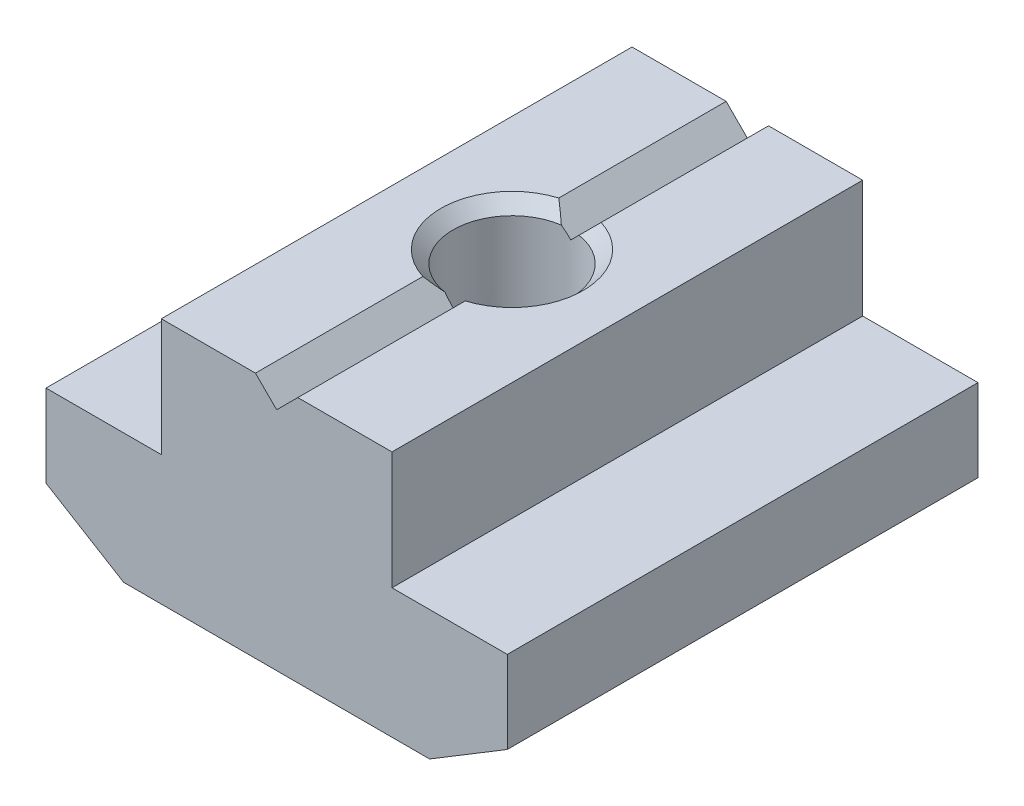
ISO-10303-21;
HEADER;
FILE_DESCRIPTION(('STEP AP214'),'2;1');
FILE_NAME('part.step','',(''),(''),'','','');
FILE_SCHEMA(('AUTOMOTIVE_DESIGN { 1 0 10303 214 1 1 1 1 }'));
ENDSEC;
DATA;
#1=APPLICATION_CONTEXT('core data for automotive mechanical design processes');
#2=APPLICATION_PROTOCOL_DEFINITION('international standard','automotive_design',2000,#1);
#3=PRODUCT_CONTEXT('',#1,'mechanical');
#4=PRODUCT('Part','Part','',(#3));
#5=PRODUCT_RELATED_PRODUCT_CATEGORY('part','',(#4));
#6=PRODUCT_DEFINITION_FORMATION('','',#4);
#7=PRODUCT_DEFINITION_CONTEXT('part definition',#1,'design');
#8=PRODUCT_DEFINITION('design','',#6,#7);
#9=PRODUCT_DEFINITION_SHAPE('','',#8);
#10=(LENGTH_UNIT() NAMED_UNIT(*) SI_UNIT(.MILLI.,.METRE.));
#11=(NAMED_UNIT(*) PLANE_ANGLE_UNIT() SI_UNIT($,.RADIAN.));
#12=(NAMED_UNIT(*) SI_UNIT($,.STERADIAN.) SOLID_ANGLE_UNIT());
#13=UNCERTAINTY_MEASURE_WITH_UNIT(LENGTH_MEASURE(1.E-05),#10,'distance_accuracy_value','');
#14=(GEOMETRIC_REPRESENTATION_CONTEXT(3) GLOBAL_UNCERTAINTY_ASSIGNED_CONTEXT((#13)) GLOBAL_UNIT_ASSIGNED_CONTEXT((#10,
#11,#12)) REPRESENTATION_CONTEXT('',''));
#15=CARTESIAN_POINT('',(0.,0.,0.));
#16=DIRECTION('',(0.,0.,1.));
#17=DIRECTION('',(1.,0.,0.));
#18=AXIS2_PLACEMENT_3D('',#15,#16,#17);
#19=CARTESIAN_POINT('',(-0.9,10.5,-45.));
#20=DIRECTION('',(-0.707106781186547,-0.707106781186548,0.));
#21=DIRECTION('',(0.707106781186548,-0.707106781186547,0.));
#22=AXIS2_PLACEMENT_3D('',#19,#20,#21);
#23=PLANE('',#22);
#24=DIRECTION('',(0.,0.,1.));
#25=VECTOR('',#24,1.);
#26=CARTESIAN_POINT('',(0.,9.6,-45.));
#27=LINE('',#26,#25);
#28=CARTESIAN_POINT('',(0.,9.6,-7.50000000000002));
#29=VERTEX_POINT('',#28);
#30=CARTESIAN_POINT('',(0.,9.6,0.));
#31=VERTEX_POINT('',#30);
#32=EDGE_CURVE('E300',#29,#31,#27,.T.);
#33=ORIENTED_EDGE('',*,*,#32,.F.);
#34=CARTESIAN_POINT('',(0.,9.6,-10.));
#35=DIRECTION('',(-0.707106781186547,-0.707106781186548,0.));
#36=DIRECTION('',(-0.707106781186548,0.707106781186547,0.));
#37=AXIS2_PLACEMENT_3D('',#34,#35,#36);
#38=ELLIPSE('',#37,3.53553390593273,2.5);
#39=CARTESIAN_POINT('',(-0.374999999999994,9.975,-7.52828500833935));
#40=VERTEX_POINT('',#39);
#41=EDGE_CURVE('E11',#29,#40,#38,.T.);
#42=ORIENTED_EDGE('',*,*,#41,.T.);
#43=CARTESIAN_POINT('',(-0.374799999999994,9.97479999999999,-7.5284569597112));
#44=CARTESIAN_POINT('',(-0.417708570571395,10.0177085705714,-7.49156815284837));
#45=CARTESIAN_POINT('',(-0.460872832569081,10.0608728325691,-7.45527855689437));
#46=CARTESIAN_POINT('',(-0.547646636628367,10.1476466366284,-7.38381885597797));
#47=CARTESIAN_POINT('',(-0.591256053100125,10.1912560531001,-7.34864844619643));
#48=CARTESIAN_POINT('',(-0.67887487539868,10.2788748753987,-7.27933024964659));
#49=CARTESIAN_POINT('',(-0.722884255260862,10.3228842552609,-7.2451823971059));
#50=CARTESIAN_POINT('',(-0.81127588042446,10.4112758804245,-7.17782368323249));
#51=CARTESIAN_POINT('',(-0.855658224805188,10.4556582248052,-7.14461308179715));
#52=CARTESIAN_POINT('',(-0.9002,10.5002,-7.1118388202872));
#53=B_SPLINE_CURVE_WITH_KNOTS('',3,(#43,#44,#45,#46,#47,#48,#49,#50,#51,#52),.UNSPECIFIED.,.F.,
.F.,(4,2,2,2,4),(0.,0.213037107931229,0.426015688104344,0.638980539625976,0.852003876790891),.UNSPECIFIED.);
#54=CARTESIAN_POINT('',(-0.899999999999998,10.5,-7.11198597648834));
#55=VERTEX_POINT('',#54);
#56=EDGE_CURVE('E237',#40,#55,#53,.T.);
#57=ORIENTED_EDGE('',*,*,#56,.T.);
#58=DIRECTION('',(0.,0.,1.));
#59=VECTOR('',#58,1.);
#60=CARTESIAN_POINT('',(-0.9,10.5,-45.));
#61=LINE('',#60,#59);
#62=CARTESIAN_POINT('',(-0.899999999999996,10.5,0.));
#63=VERTEX_POINT('',#62);
#64=EDGE_CURVE('E74',#55,#63,#61,.T.);
#65=ORIENTED_EDGE('',*,*,#64,.T.);
#66=DIRECTION('',(0.707106781186548,-0.707106781186547,0.));
#67=VECTOR('',#66,1.);
#68=CARTESIAN_POINT('',(-0.9,10.5,0.));
#69=LINE('',#68,#67);
#70=EDGE_CURVE('E301',#63,#31,#69,.T.);
#71=ORIENTED_EDGE('',*,*,#70,.T.);
#72=EDGE_LOOP('',(#33,#42,#57,#65,#71));
#73=FACE_BOUND('',#72,.T.);
#74=ADVANCED_FACE('F51',(#73),#23,.F.);
#75=CARTESIAN_POINT('',(0.,9.6,-45.));
#76=DIRECTION('',(0.707106781186547,-0.707106781186548,0.));
#77=DIRECTION('',(0.707106781186548,0.707106781186547,0.));
#78=AXIS2_PLACEMENT_3D('',#75,#76,#77);
#79=PLANE('',#78);
#80=CARTESIAN_POINT('',(0.,9.6,-20.));
#81=VERTEX_POINT('',#80);
#82=CARTESIAN_POINT('',(0.,9.6,-12.5));
#83=VERTEX_POINT('',#82);
#84=EDGE_CURVE('E196',#81,#83,#27,.T.);
#85=ORIENTED_EDGE('',*,*,#84,.T.);
#86=CARTESIAN_POINT('',(0.,9.6,-10.));
#87=DIRECTION('',(0.707106781186547,-0.707106781186548,0.));
#88=DIRECTION('',(0.707106781186548,0.707106781186547,0.));
#89=AXIS2_PLACEMENT_3D('',#86,#87,#88);
#90=ELLIPSE('',#89,3.53553390593273,2.5);
#91=CARTESIAN_POINT('',(0.374999999999994,9.975,-12.4717149916606));
#92=VERTEX_POINT('',#91);
#93=EDGE_CURVE('E183',#83,#92,#90,.T.);
#94=ORIENTED_EDGE('',*,*,#93,.T.);
#95=CARTESIAN_POINT('',(0.374799999999994,9.97479999999999,-12.4715430402888));
#96=CARTESIAN_POINT('',(0.417708570571396,10.0177085705714,-12.5084318471516));
#97=CARTESIAN_POINT('',(0.460872832569081,10.0608728325691,-12.5447214431056));
#98=CARTESIAN_POINT('',(0.547646636628368,10.1476466366284,-12.616181144022));
#99=CARTESIAN_POINT('',(0.591256053100125,10.1912560531001,-12.6513515538036));
#100=CARTESIAN_POINT('',(0.67887487539868,10.2788748753987,-12.7206697503534));
#101=CARTESIAN_POINT('',(0.722884255260862,10.3228842552609,-12.7548176028941));
#102=CARTESIAN_POINT('',(0.81127588042446,10.4112758804245,-12.8221763167675));
#103=CARTESIAN_POINT('',(0.855658224805188,10.4556582248052,-12.8553869182028));
#104=CARTESIAN_POINT('',(0.9002,10.5002,-12.8881611797128));
#105=B_SPLINE_CURVE_WITH_KNOTS('',3,(#95,#96,#97,#98,#99,#100,#101,#102,#103,#104),
.UNSPECIFIED.,.F.,.F.,(4,2,2,2,4),(0.,0.213037107931227,0.426015688104344,0.638980539625976,
0.852003876790891),.UNSPECIFIED.);
#106=CARTESIAN_POINT('',(0.899999999999998,10.5,-12.8880140235117));
#107=VERTEX_POINT('',#106);
#108=EDGE_CURVE('E176',#92,#107,#105,.T.);
#109=ORIENTED_EDGE('',*,*,#108,.T.);
#110=DIRECTION('',(0.,0.,1.));
#111=VECTOR('',#110,1.);
#112=CARTESIAN_POINT('',(0.9,10.5,-45.));
#113=LINE('',#112,#111);
#114=CARTESIAN_POINT('',(0.9,10.5,-20.));
#115=VERTEX_POINT('',#114);
#116=EDGE_CURVE('E310',#115,#107,#113,.T.);
#117=ORIENTED_EDGE('',*,*,#116,.F.);
#118=DIRECTION('',(0.707106781186548,0.707106781186547,0.));
#119=VECTOR('',#118,1.);
#120=CARTESIAN_POINT('',(-4.8,4.80000000000001,-20.));
#121=LINE('',#120,#119);
#122=EDGE_CURVE('E316',#81,#115,#121,.T.);
#123=ORIENTED_EDGE('',*,*,#122,.F.);
#124=EDGE_LOOP('',(#85,#94,#109,#117,#123));
#125=FACE_BOUND('',#124,.T.);
#126=ADVANCED_FACE('F194',(#125),#79,.F.);
#127=CARTESIAN_POINT('',(-4.9,10.5,-20.));
#128=DIRECTION('',(0.,1.,0.));
#129=DIRECTION('',(0.,0.,1.));
#130=AXIS2_PLACEMENT_3D('',#127,#128,#129);
#131=PLANE('',#130);
#132=CARTESIAN_POINT('',(0.,10.5,-10.));
#133=DIRECTION('',(0.,1.,0.));
#134=DIRECTION('',(0.,0.,1.));
#135=AXIS2_PLACEMENT_3D('',#132,#133,#134);
#136=CIRCLE('',#135,3.025);
#137=CARTESIAN_POINT('',(0.899999999999998,10.5,-7.11198597648834));
#138=VERTEX_POINT('',#137);
#139=EDGE_CURVE('E179',#138,#107,#136,.T.);
#140=ORIENTED_EDGE('',*,*,#139,.F.);
#141=CARTESIAN_POINT('',(0.9,10.5,0.));
#142=VERTEX_POINT('',#141);
#143=EDGE_CURVE('E306',#138,#142,#113,.T.);
#144=ORIENTED_EDGE('',*,*,#143,.T.);
#145=DIRECTION('',(-1.,0.,0.));
#146=VECTOR('',#145,1.);
#147=CARTESIAN_POINT('',(-4.9,10.5,0.));
#148=LINE('',#147,#146);
#149=CARTESIAN_POINT('',(4.9,10.5,0.));
#150=VERTEX_POINT('',#149);
#151=EDGE_CURVE('E376',#150,#142,#148,.T.);
#152=ORIENTED_EDGE('',*,*,#151,.F.);
#153=DIRECTION('',(0.,0.,1.));
#154=VECTOR('',#153,1.);
#155=CARTESIAN_POINT('',(4.9,10.5,-20.));
#156=LINE('',#155,#154);
#157=CARTESIAN_POINT('',(4.9,10.5,-20.));
#158=VERTEX_POINT('',#157);
#159=EDGE_CURVE('E383',#158,#150,#156,.T.);
#160=ORIENTED_EDGE('',*,*,#159,.F.);
#161=DIRECTION('',(-1.,0.,0.));
#162=VECTOR('',#161,1.);
#163=CARTESIAN_POINT('',(-4.9,10.5,-20.));
#164=LINE('',#163,#162);
#165=EDGE_CURVE('E346',#158,#115,#164,.T.);
#166=ORIENTED_EDGE('',*,*,#165,.T.);
#167=ORIENTED_EDGE('',*,*,#116,.T.);
#168=EDGE_LOOP('',(#140,#144,#152,#160,#166,#167));
#169=FACE_BOUND('',#168,.T.);
#170=ADVANCED_FACE('F268',(#169),#131,.T.);
#171=CARTESIAN_POINT('',(-9.8,5.5,-20.));
#172=DIRECTION('',(0.,1.,0.));
#173=DIRECTION('',(0.,0.,1.));
#174=AXIS2_PLACEMENT_3D('',#171,#172,#173);
#175=PLANE('',#174);
#176=DIRECTION('',(-1.,0.,0.));
#177=VECTOR('',#176,1.);
#178=CARTESIAN_POINT('',(-9.8,5.5,0.));
#179=LINE('',#178,#177);
#180=CARTESIAN_POINT('',(-4.9,5.5,0.));
#181=VERTEX_POINT('',#180);
#182=CARTESIAN_POINT('',(-9.8,5.5,0.));
#183=VERTEX_POINT('',#182);
#184=EDGE_CURVE('E319',#181,#183,#179,.T.);
#185=ORIENTED_EDGE('',*,*,#184,.F.);
#186=DIRECTION('',(0.,0.,1.));
#187=VECTOR('',#186,1.);
#188=CARTESIAN_POINT('',(-4.9,5.5,-20.));
#189=LINE('',#188,#187);
#190=CARTESIAN_POINT('',(-4.9,5.5,-20.));
#191=VERTEX_POINT('',#190);
#192=EDGE_CURVE('E202',#191,#181,#189,.T.);
#193=ORIENTED_EDGE('',*,*,#192,.F.);
#194=DIRECTION('',(-1.,0.,0.));
#195=VECTOR('',#194,1.);
#196=CARTESIAN_POINT('',(-9.8,5.5,-20.));
#197=LINE('',#196,#195);
#198=CARTESIAN_POINT('',(-9.8,5.5,-20.));
#199=VERTEX_POINT('',#198);
#200=EDGE_CURVE('E320',#191,#199,#197,.T.);
#201=ORIENTED_EDGE('',*,*,#200,.T.);
#202=DIRECTION('',(0.,0.,1.));
#203=VECTOR('',#202,1.);
#204=CARTESIAN_POINT('',(-9.8,5.5,-20.));
#205=LINE('',#204,#203);
#206=EDGE_CURVE('E213',#199,#183,#205,.T.);
#207=ORIENTED_EDGE('',*,*,#206,.T.);
#208=EDGE_LOOP('',(#185,#193,#201,#207));
#209=FACE_BOUND('',#208,.T.);
#210=ADVANCED_FACE('F53',(#209),#175,.T.);
#211=CARTESIAN_POINT('',(-4.9,5.5,-20.));
#212=DIRECTION('',(-1.,0.,0.));
#213=DIRECTION('',(0.,-1.,0.));
#214=AXIS2_PLACEMENT_3D('',#211,#212,#213);
#215=PLANE('',#214);
#216=DIRECTION('',(0.,-1.,0.));
#217=VECTOR('',#216,1.);
#218=CARTESIAN_POINT('',(-4.9,5.5,0.));
#219=LINE('',#218,#217);
#220=CARTESIAN_POINT('',(-4.9,10.5,0.));
#221=VERTEX_POINT('',#220);
#222=EDGE_CURVE('E324',#221,#181,#219,.T.);
#223=ORIENTED_EDGE('',*,*,#222,.F.);
#224=DIRECTION('',(0.,0.,1.));
#225=VECTOR('',#224,1.);
#226=CARTESIAN_POINT('',(-4.9,10.5,-20.));
#227=LINE('',#226,#225);
#228=CARTESIAN_POINT('',(-4.9,10.5,-20.));
#229=VERTEX_POINT('',#228);
#230=EDGE_CURVE('E204',#229,#221,#227,.T.);
#231=ORIENTED_EDGE('',*,*,#230,.F.);
#232=DIRECTION('',(0.,-1.,0.));
#233=VECTOR('',#232,1.);
#234=CARTESIAN_POINT('',(-4.9,5.5,-20.));
#235=LINE('',#234,#233);
#236=EDGE_CURVE('E349',#229,#191,#235,.T.);
#237=ORIENTED_EDGE('',*,*,#236,.T.);
#238=ORIENTED_EDGE('',*,*,#192,.T.);
#239=EDGE_LOOP('',(#223,#231,#237,#238));
#240=FACE_BOUND('',#239,.T.);
#241=ADVANCED_FACE('F259',(#240),#215,.T.);
#242=CARTESIAN_POINT('',(-0.899999999999998,10.5,-12.8880140235117));
#243=VERTEX_POINT('',#242);
#244=EDGE_CURVE('E430',#243,#55,#136,.T.);
#245=ORIENTED_EDGE('',*,*,#244,.F.);
#246=CARTESIAN_POINT('',(-0.9,10.5,-20.));
#247=VERTEX_POINT('',#246);
#248=EDGE_CURVE('E304',#247,#243,#61,.T.);
#249=ORIENTED_EDGE('',*,*,#248,.F.);
#250=EDGE_CURVE('E345',#247,#229,#164,.T.);
#251=ORIENTED_EDGE('',*,*,#250,.T.);
#252=ORIENTED_EDGE('',*,*,#230,.T.);
#253=EDGE_CURVE('E375',#63,#221,#148,.T.);
#254=ORIENTED_EDGE('',*,*,#253,.F.);
#255=ORIENTED_EDGE('',*,*,#64,.F.);
#256=EDGE_LOOP('',(#245,#249,#251,#252,#254,#255));
#257=FACE_BOUND('',#256,.T.);
#258=ADVANCED_FACE('F262',(#257),#131,.T.);
#259=CARTESIAN_POINT('',(4.9,5.5,-20.));
#260=DIRECTION('',(1.,0.,0.));
#261=DIRECTION('',(0.,1.,0.));
#262=AXIS2_PLACEMENT_3D('',#259,#260,#261);
#263=PLANE('',#262);
#264=DIRECTION('',(0.,1.,0.));
#265=VECTOR('',#264,1.);
#266=CARTESIAN_POINT('',(4.9,5.5,0.));
#267=LINE('',#266,#265);
#268=CARTESIAN_POINT('',(4.9,5.5,0.));
#269=VERTEX_POINT('',#268);
#270=EDGE_CURVE('E372',#269,#150,#267,.T.);
#271=ORIENTED_EDGE('',*,*,#270,.F.);
#272=DIRECTION('',(0.,0.,1.));
#273=VECTOR('',#272,1.);
#274=CARTESIAN_POINT('',(4.9,5.5,-20.));
#275=LINE('',#274,#273);
#276=CARTESIAN_POINT('',(4.9,5.5,-20.));
#277=VERTEX_POINT('',#276);
#278=EDGE_CURVE('E385',#277,#269,#275,.T.);
#279=ORIENTED_EDGE('',*,*,#278,.F.);
#280=DIRECTION('',(0.,1.,0.));
#281=VECTOR('',#280,1.);
#282=CARTESIAN_POINT('',(4.9,5.5,-20.));
#283=LINE('',#282,#281);
#284=EDGE_CURVE('E342',#277,#158,#283,.T.);
#285=ORIENTED_EDGE('',*,*,#284,.T.);
#286=ORIENTED_EDGE('',*,*,#159,.T.);
#287=EDGE_LOOP('',(#271,#279,#285,#286));
#288=FACE_BOUND('',#287,.T.);
#289=ADVANCED_FACE('F266',(#288),#263,.T.);
#290=CARTESIAN_POINT('',(9.8,5.5,-20.));
#291=DIRECTION('',(0.,1.,0.));
#292=DIRECTION('',(0.,0.,1.));
#293=AXIS2_PLACEMENT_3D('',#290,#291,#292);
#294=PLANE('',#293);
#295=DIRECTION('',(-1.,0.,0.));
#296=VECTOR('',#295,1.);
#297=CARTESIAN_POINT('',(9.8,5.5,0.));
#298=LINE('',#297,#296);
#299=CARTESIAN_POINT('',(9.8,5.5,0.));
#300=VERTEX_POINT('',#299);
#301=EDGE_CURVE('E369',#300,#269,#298,.T.);
#302=ORIENTED_EDGE('',*,*,#301,.F.);
#303=DIRECTION('',(0.,0.,1.));
#304=VECTOR('',#303,1.);
#305=CARTESIAN_POINT('',(9.8,5.5,-20.));
#306=LINE('',#305,#304);
#307=CARTESIAN_POINT('',(9.8,5.5,-20.));
#308=VERTEX_POINT('',#307);
#309=EDGE_CURVE('E387',#308,#300,#306,.T.);
#310=ORIENTED_EDGE('',*,*,#309,.F.);
#311=DIRECTION('',(-1.,0.,0.));
#312=VECTOR('',#311,1.);
#313=CARTESIAN_POINT('',(9.8,5.5,-20.));
#314=LINE('',#313,#312);
#315=EDGE_CURVE('E339',#308,#277,#314,.T.);
#316=ORIENTED_EDGE('',*,*,#315,.T.);
#317=ORIENTED_EDGE('',*,*,#278,.T.);
#318=EDGE_LOOP('',(#302,#310,#316,#317));
#319=FACE_BOUND('',#318,.T.);
#320=ADVANCED_FACE('F271',(#319),#294,.T.);
#321=CARTESIAN_POINT('',(9.8,2.,-20.));
#322=DIRECTION('',(1.,0.,0.));
#323=DIRECTION('',(0.,0.,-1.));
#324=AXIS2_PLACEMENT_3D('',#321,#322,#323);
#325=PLANE('',#324);
#326=DIRECTION('',(0.,1.,0.));
#327=VECTOR('',#326,1.);
#328=CARTESIAN_POINT('',(9.8,2.,0.));
#329=LINE('',#328,#327);
#330=CARTESIAN_POINT('',(9.8,2.,0.));
#331=VERTEX_POINT('',#330);
#332=EDGE_CURVE('E366',#331,#300,#329,.T.);
#333=ORIENTED_EDGE('',*,*,#332,.F.);
#334=DIRECTION('',(0.,0.,1.));
#335=VECTOR('',#334,1.);
#336=CARTESIAN_POINT('',(9.8,2.,-20.));
#337=LINE('',#336,#335);
#338=CARTESIAN_POINT('',(9.8,2.,-20.));
#339=VERTEX_POINT('',#338);
#340=EDGE_CURVE('E389',#339,#331,#337,.T.);
#341=ORIENTED_EDGE('',*,*,#340,.F.);
#342=DIRECTION('',(0.,1.,0.));
#343=VECTOR('',#342,1.);
#344=CARTESIAN_POINT('',(9.8,2.,-20.));
#345=LINE('',#344,#343);
#346=EDGE_CURVE('E336',#339,#308,#345,.T.);
#347=ORIENTED_EDGE('',*,*,#346,.T.);
#348=ORIENTED_EDGE('',*,*,#309,.T.);
#349=EDGE_LOOP('',(#333,#341,#347,#348));
#350=FACE_BOUND('',#349,.T.);
#351=ADVANCED_FACE('F275',(#350),#325,.T.);
#352=CARTESIAN_POINT('',(6.5,0.,-20.));
#353=DIRECTION('',(0.518301716093344,-0.855197831554018,0.));
#354=DIRECTION('',(0.855197831554018,0.518301716093344,0.));
#355=AXIS2_PLACEMENT_3D('',#352,#353,#354);
#356=PLANE('',#355);
#357=DIRECTION('',(0.855197831554018,0.518301716093344,0.));
#358=VECTOR('',#357,1.);
#359=CARTESIAN_POINT('',(6.5,0.,0.));
#360=LINE('',#359,#358);
#361=CARTESIAN_POINT('',(6.5,0.,0.));
#362=VERTEX_POINT('',#361);
#363=EDGE_CURVE('E363',#362,#331,#360,.T.);
#364=ORIENTED_EDGE('',*,*,#363,.F.);
#365=DIRECTION('',(0.,0.,1.));
#366=VECTOR('',#365,1.);
#367=CARTESIAN_POINT('',(6.5,0.,-20.));
#368=LINE('',#367,#366);
#369=CARTESIAN_POINT('',(6.5,0.,-20.));
#370=VERTEX_POINT('',#369);
#371=EDGE_CURVE('E391',#370,#362,#368,.T.);
#372=ORIENTED_EDGE('',*,*,#371,.F.);
#373=DIRECTION('',(0.855197831554018,0.518301716093344,0.));
#374=VECTOR('',#373,1.);
#375=CARTESIAN_POINT('',(6.5,0.,-20.));
#376=LINE('',#375,#374);
#377=EDGE_CURVE('E333',#370,#339,#376,.T.);
#378=ORIENTED_EDGE('',*,*,#377,.T.);
#379=ORIENTED_EDGE('',*,*,#340,.T.);
#380=EDGE_LOOP('',(#364,#372,#378,#379));
#381=FACE_BOUND('',#380,.T.);
#382=ADVANCED_FACE('F279',(#381),#356,.T.);
#383=CARTESIAN_POINT('',(6.5,0.,-20.));
#384=DIRECTION('',(0.,-1.,0.));
#385=DIRECTION('',(0.,0.,-1.));
#386=AXIS2_PLACEMENT_3D('',#383,#384,#385);
#387=PLANE('',#386);
#388=CARTESIAN_POINT('',(0.,0.,-10.));
#389=DIRECTION('',(0.,-1.,0.));
#390=DIRECTION('',(0.,0.,-1.));
#391=AXIS2_PLACEMENT_3D('',#388,#389,#390);
#392=CIRCLE('',#391,2.5);
#393=CARTESIAN_POINT('',(0.,0.,-12.5));
#394=VERTEX_POINT('',#393);
#395=EDGE_CURVE('E421',#394,#394,#392,.T.);
#396=ORIENTED_EDGE('',*,*,#395,.F.);
#397=EDGE_LOOP('',(#396));
#398=FACE_BOUND('',#397,.T.);
#399=DIRECTION('',(1.,0.,0.));
#400=VECTOR('',#399,1.);
#401=CARTESIAN_POINT('',(6.5,0.,0.));
#402=LINE('',#401,#400);
#403=CARTESIAN_POINT('',(-6.5,0.,0.));
#404=VERTEX_POINT('',#403);
#405=EDGE_CURVE('E360',#404,#362,#402,.T.);
#406=ORIENTED_EDGE('',*,*,#405,.F.);
#407=DIRECTION('',(0.,0.,1.));
#408=VECTOR('',#407,1.);
#409=CARTESIAN_POINT('',(-6.5,0.,-20.));
#410=LINE('',#409,#408);
#411=CARTESIAN_POINT('',(-6.5,0.,-20.));
#412=VERTEX_POINT('',#411);
#413=EDGE_CURVE('E393',#412,#404,#410,.T.);
#414=ORIENTED_EDGE('',*,*,#413,.F.);
#415=DIRECTION('',(1.,0.,0.));
#416=VECTOR('',#415,1.);
#417=CARTESIAN_POINT('',(6.5,0.,-20.));
#418=LINE('',#417,#416);
#419=EDGE_CURVE('E330',#412,#370,#418,.T.);
#420=ORIENTED_EDGE('',*,*,#419,.T.);
#421=ORIENTED_EDGE('',*,*,#371,.T.);
#422=EDGE_LOOP('',(#406,#414,#420,#421));
#423=FACE_BOUND('',#422,.T.);
#424=ADVANCED_FACE('F283',(#398,#423),#387,.T.);
#425=CARTESIAN_POINT('',(-6.5,0.,-20.));
#426=DIRECTION('',(-0.518301716093344,-0.855197831554018,0.));
#427=DIRECTION('',(0.855197831554018,-0.518301716093344,0.));
#428=AXIS2_PLACEMENT_3D('',#425,#426,#427);
#429=PLANE('',#428);
#430=DIRECTION('',(0.855197831554018,-0.518301716093344,0.));
#431=VECTOR('',#430,1.);
#432=CARTESIAN_POINT('',(-6.5,0.,0.));
#433=LINE('',#432,#431);
#434=CARTESIAN_POINT('',(-9.8,2.,0.));
#435=VERTEX_POINT('',#434);
#436=EDGE_CURVE('E357',#435,#404,#433,.T.);
#437=ORIENTED_EDGE('',*,*,#436,.F.);
#438=DIRECTION('',(0.,0.,1.));
#439=VECTOR('',#438,1.);
#440=CARTESIAN_POINT('',(-9.8,2.,-20.));
#441=LINE('',#440,#439);
#442=CARTESIAN_POINT('',(-9.8,2.,-20.));
#443=VERTEX_POINT('',#442);
#444=EDGE_CURVE('E394',#443,#435,#441,.T.);
#445=ORIENTED_EDGE('',*,*,#444,.F.);
#446=DIRECTION('',(0.855197831554018,-0.518301716093344,0.));
#447=VECTOR('',#446,1.);
#448=CARTESIAN_POINT('',(-6.5,0.,-20.));
#449=LINE('',#448,#447);
#450=EDGE_CURVE('E327',#443,#412,#449,.T.);
#451=ORIENTED_EDGE('',*,*,#450,.T.);
#452=ORIENTED_EDGE('',*,*,#413,.T.);
#453=EDGE_LOOP('',(#437,#445,#451,#452));
#454=FACE_BOUND('',#453,.T.);
#455=ADVANCED_FACE('F287',(#454),#429,.T.);
#456=CARTESIAN_POINT('',(-9.8,2.,-20.));
#457=DIRECTION('',(-1.,0.,0.));
#458=DIRECTION('',(0.,0.,1.));
#459=AXIS2_PLACEMENT_3D('',#456,#457,#458);
#460=PLANE('',#459);
#461=DIRECTION('',(0.,-1.,0.));
#462=VECTOR('',#461,1.);
#463=CARTESIAN_POINT('',(-9.8,2.,0.));
#464=LINE('',#463,#462);
#465=EDGE_CURVE('E354',#183,#435,#464,.T.);
#466=ORIENTED_EDGE('',*,*,#465,.F.);
#467=ORIENTED_EDGE('',*,*,#206,.F.);
#468=DIRECTION('',(0.,-1.,0.));
#469=VECTOR('',#468,1.);
#470=CARTESIAN_POINT('',(-9.8,2.,-20.));
#471=LINE('',#470,#469);
#472=EDGE_CURVE('E323',#199,#443,#471,.T.);
#473=ORIENTED_EDGE('',*,*,#472,.T.);
#474=ORIENTED_EDGE('',*,*,#444,.T.);
#475=EDGE_LOOP('',(#466,#467,#473,#474));
#476=FACE_BOUND('',#475,.T.);
#477=ADVANCED_FACE('F254',(#476),#460,.T.);
#478=CARTESIAN_POINT('',(0.,0.,-20.));
#479=DIRECTION('',(0.,0.,1.));
#480=DIRECTION('',(1.,0.,0.));
#481=AXIS2_PLACEMENT_3D('',#478,#479,#480);
#482=PLANE('',#481);
#483=DIRECTION('',(0.707106781186548,-0.707106781186547,0.));
#484=VECTOR('',#483,1.);
#485=CARTESIAN_POINT('',(4.8,4.80000000000001,-20.));
#486=LINE('',#485,#484);
#487=EDGE_CURVE('E313',#247,#81,#486,.T.);
#488=ORIENTED_EDGE('',*,*,#487,.T.);
#489=ORIENTED_EDGE('',*,*,#122,.T.);
#490=ORIENTED_EDGE('',*,*,#165,.F.);
#491=ORIENTED_EDGE('',*,*,#284,.F.);
#492=ORIENTED_EDGE('',*,*,#315,.F.);
#493=ORIENTED_EDGE('',*,*,#346,.F.);
#494=ORIENTED_EDGE('',*,*,#377,.F.);
#495=ORIENTED_EDGE('',*,*,#419,.F.);
#496=ORIENTED_EDGE('',*,*,#450,.F.);
#497=ORIENTED_EDGE('',*,*,#472,.F.);
#498=ORIENTED_EDGE('',*,*,#200,.F.);
#499=ORIENTED_EDGE('',*,*,#236,.F.);
#500=ORIENTED_EDGE('',*,*,#250,.F.);
#501=EDGE_LOOP('',(#488,#489,#490,#491,#492,#493,#494,#495,#496,#497,#498,#499,#500));
#502=FACE_BOUND('',#501,.T.);
#503=ADVANCED_FACE('F249',(#502),#482,.F.);
#504=CARTESIAN_POINT('',(0.,0.,0.));
#505=DIRECTION('',(0.,0.,1.));
#506=DIRECTION('',(1.,0.,0.));
#507=AXIS2_PLACEMENT_3D('',#504,#505,#506);
#508=PLANE('',#507);
#509=DIRECTION('',(0.707106781186548,0.707106781186547,0.));
#510=VECTOR('',#509,1.);
#511=CARTESIAN_POINT('',(0.,9.6,0.));
#512=LINE('',#511,#510);
#513=EDGE_CURVE('E420',#31,#142,#512,.T.);
#514=ORIENTED_EDGE('',*,*,#513,.F.);
#515=ORIENTED_EDGE('',*,*,#70,.F.);
#516=ORIENTED_EDGE('',*,*,#253,.T.);
#517=ORIENTED_EDGE('',*,*,#222,.T.);
#518=ORIENTED_EDGE('',*,*,#184,.T.);
#519=ORIENTED_EDGE('',*,*,#465,.T.);
#520=ORIENTED_EDGE('',*,*,#436,.T.);
#521=ORIENTED_EDGE('',*,*,#405,.T.);
#522=ORIENTED_EDGE('',*,*,#363,.T.);
#523=ORIENTED_EDGE('',*,*,#332,.T.);
#524=ORIENTED_EDGE('',*,*,#301,.T.);
#525=ORIENTED_EDGE('',*,*,#270,.T.);
#526=ORIENTED_EDGE('',*,*,#151,.T.);
#527=EDGE_LOOP('',(#514,#515,#516,#517,#518,#519,#520,#521,#522,#523,#524,#525,#526));
#528=FACE_BOUND('',#527,.T.);
#529=ADVANCED_FACE('F253',(#528),#508,.T.);
#530=CARTESIAN_POINT('',(0.9002,10.5002,-7.1118388202872));
#531=CARTESIAN_POINT('',(0.855658224805188,10.4556582248052,-7.14461308179715));
#532=CARTESIAN_POINT('',(0.81127588042446,10.4112758804245,-7.17782368323249));
#533=CARTESIAN_POINT('',(0.722884255260862,10.3228842552609,-7.2451823971059));
#534=CARTESIAN_POINT('',(0.67887487539868,10.2788748753987,-7.27933024964659));
#535=CARTESIAN_POINT('',(0.591256053100125,10.1912560531001,-7.34864844619643));
#536=CARTESIAN_POINT('',(0.547646636628368,10.1476466366284,-7.38381885597797));
#537=CARTESIAN_POINT('',(0.460872832569081,10.0608728325691,-7.45527855689437));
#538=CARTESIAN_POINT('',(0.417708570571396,10.0177085705714,-7.49156815284837));
#539=CARTESIAN_POINT('',(0.374799999999994,9.97479999999999,-7.5284569597112));
#540=B_SPLINE_CURVE_WITH_KNOTS('',3,(#530,#531,#532,#533,#534,#535,#536,#537,#538,#539),
.UNSPECIFIED.,.F.,.F.,(4,2,2,2,4),(0.,0.213023337164915,0.425988188686547,0.638966768859662,
0.852003876790891),.UNSPECIFIED.);
#541=CARTESIAN_POINT('',(0.374999999999994,9.975,-7.52828500833935));
#542=VERTEX_POINT('',#541);
#543=EDGE_CURVE('E199',#138,#542,#540,.T.);
#544=ORIENTED_EDGE('',*,*,#543,.T.);
#545=EDGE_CURVE('E184',#542,#29,#90,.T.);
#546=ORIENTED_EDGE('',*,*,#545,.T.);
#547=ORIENTED_EDGE('',*,*,#32,.T.);
#548=ORIENTED_EDGE('',*,*,#513,.T.);
#549=ORIENTED_EDGE('',*,*,#143,.F.);
#550=EDGE_LOOP('',(#544,#546,#547,#548,#549));
#551=FACE_BOUND('',#550,.T.);
#552=ADVANCED_FACE('F215',(#551),#79,.F.);
#553=CARTESIAN_POINT('',(-0.9002,10.5002,-12.8881611797128));
#554=CARTESIAN_POINT('',(-0.855658224805188,10.4556582248052,-12.8553869182028));
#555=CARTESIAN_POINT('',(-0.81127588042446,10.4112758804245,-12.8221763167675));
#556=CARTESIAN_POINT('',(-0.722884255260862,10.3228842552609,-12.7548176028941));
#557=CARTESIAN_POINT('',(-0.678874875398679,10.2788748753987,-12.7206697503534));
#558=CARTESIAN_POINT('',(-0.591256053100125,10.1912560531001,-12.6513515538036));
#559=CARTESIAN_POINT('',(-0.547646636628367,10.1476466366284,-12.616181144022));
#560=CARTESIAN_POINT('',(-0.460872832569081,10.0608728325691,-12.5447214431056));
#561=CARTESIAN_POINT('',(-0.417708570571396,10.0177085705714,-12.5084318471516));
#562=CARTESIAN_POINT('',(-0.374799999999993,9.97479999999999,-12.4715430402888));
#563=B_SPLINE_CURVE_WITH_KNOTS('',3,(#553,#554,#555,#556,#557,#558,#559,#560,#561,#562),
.UNSPECIFIED.,.F.,.F.,(4,2,2,2,4),(0.,0.213023337164915,0.425988188686547,0.638966768859663,
0.85200387679089),.UNSPECIFIED.);
#564=CARTESIAN_POINT('',(-0.374999999999994,9.975,-12.4717149916606));
#565=VERTEX_POINT('',#564);
#566=EDGE_CURVE('E190',#243,#565,#563,.T.);
#567=ORIENTED_EDGE('',*,*,#566,.T.);
#568=EDGE_CURVE('E55',#565,#83,#38,.T.);
#569=ORIENTED_EDGE('',*,*,#568,.T.);
#570=ORIENTED_EDGE('',*,*,#84,.F.);
#571=ORIENTED_EDGE('',*,*,#487,.F.);
#572=ORIENTED_EDGE('',*,*,#248,.T.);
#573=EDGE_LOOP('',(#567,#569,#570,#571,#572));
#574=FACE_BOUND('',#573,.T.);
#575=ADVANCED_FACE('F244',(#574),#23,.F.);
#576=CARTESIAN_POINT('',(0.,10.5,-10.));
#577=DIRECTION('',(0.,1.,0.));
#578=DIRECTION('',(0.,0.,1.));
#579=AXIS2_PLACEMENT_3D('',#576,#577,#578);
#580=CYLINDRICAL_SURFACE('',#579,2.5);
#581=ORIENTED_EDGE('',*,*,#395,.T.);
#582=EDGE_LOOP('',(#581));
#583=FACE_BOUND('',#582,.T.);
#584=ORIENTED_EDGE('',*,*,#568,.F.);
#585=CARTESIAN_POINT('',(0.,9.975,-10.));
#586=DIRECTION('',(0.,1.,0.));
#587=DIRECTION('',(0.,0.,1.));
#588=AXIS2_PLACEMENT_3D('',#585,#586,#587);
#589=CIRCLE('',#588,2.5);
#590=EDGE_CURVE('E191',#565,#40,#589,.T.);
#591=ORIENTED_EDGE('',*,*,#590,.T.);
#592=ORIENTED_EDGE('',*,*,#41,.F.);
#593=ORIENTED_EDGE('',*,*,#545,.F.);
#594=EDGE_CURVE('E66',#542,#92,#589,.T.);
#595=ORIENTED_EDGE('',*,*,#594,.T.);
#596=ORIENTED_EDGE('',*,*,#93,.F.);
#597=EDGE_LOOP('',(#584,#591,#592,#593,#595,#596));
#598=FACE_BOUND('',#597,.T.);
#599=ADVANCED_FACE('F186',(#583,#598),#580,.F.);
#600=CARTESIAN_POINT('',(0.,10.5,-10.));
#601=DIRECTION('',(0.,1.,0.));
#602=DIRECTION('',(0.,0.,1.));
#603=AXIS2_PLACEMENT_3D('',#600,#601,#602);
#604=CONICAL_SURFACE('',#603,3.025,0.785398163397447);
#605=ORIENTED_EDGE('',*,*,#590,.F.);
#606=ORIENTED_EDGE('',*,*,#566,.F.);
#607=ORIENTED_EDGE('',*,*,#244,.T.);
#608=ORIENTED_EDGE('',*,*,#56,.F.);
#609=EDGE_LOOP('',(#605,#606,#607,#608));
#610=FACE_BOUND('',#609,.T.);
#611=ADVANCED_FACE('F219',(#610),#604,.F.);
#612=ORIENTED_EDGE('',*,*,#594,.F.);
#613=ORIENTED_EDGE('',*,*,#543,.F.);
#614=ORIENTED_EDGE('',*,*,#139,.T.);
#615=ORIENTED_EDGE('',*,*,#108,.F.);
#616=EDGE_LOOP('',(#612,#613,#614,#615));
#617=FACE_BOUND('',#616,.T.);
#618=ADVANCED_FACE('F177',(#617),#604,.F.);
#619=CLOSED_SHELL('',(#74,#126,#170,#210,#241,#258,#289,#320,#351,#382,#424,#455,#477,#503,#529,
#552,#575,#599,#611,#618));
#620=MANIFOLD_SOLID_BREP('B2',#619);
#621=ADVANCED_BREP_SHAPE_REPRESENTATION('',(#18,#620),#14);
#622=SHAPE_DEFINITION_REPRESENTATION(#9,#621);
ENDSEC;
END-ISO-10303-21;
